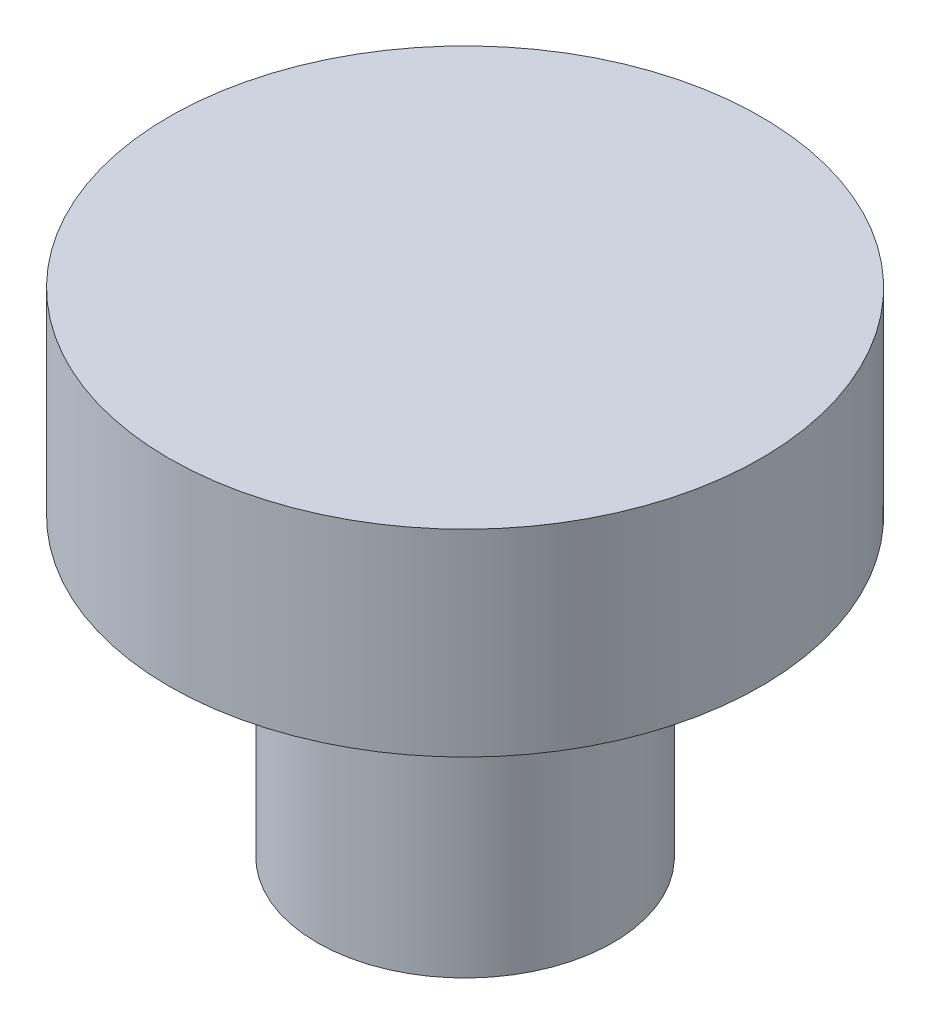
ISO-10303-21;
HEADER;
FILE_DESCRIPTION(('STEP AP214'),'2;1');
FILE_NAME('part.step','',(''),(''),'','','');
FILE_SCHEMA(('AUTOMOTIVE_DESIGN { 1 0 10303 214 1 1 1 1 }'));
ENDSEC;
DATA;
#1=APPLICATION_CONTEXT('core data for automotive mechanical design processes');
#2=APPLICATION_PROTOCOL_DEFINITION('international standard','automotive_design',2000,#1);
#3=PRODUCT_CONTEXT('',#1,'mechanical');
#4=PRODUCT('Part','Part','',(#3));
#5=PRODUCT_RELATED_PRODUCT_CATEGORY('part','',(#4));
#6=PRODUCT_DEFINITION_FORMATION('','',#4);
#7=PRODUCT_DEFINITION_CONTEXT('part definition',#1,'design');
#8=PRODUCT_DEFINITION('design','',#6,#7);
#9=PRODUCT_DEFINITION_SHAPE('','',#8);
#10=(LENGTH_UNIT() NAMED_UNIT(*) SI_UNIT(.MILLI.,.METRE.));
#11=(NAMED_UNIT(*) PLANE_ANGLE_UNIT() SI_UNIT($,.RADIAN.));
#12=(NAMED_UNIT(*) SI_UNIT($,.STERADIAN.) SOLID_ANGLE_UNIT());
#13=UNCERTAINTY_MEASURE_WITH_UNIT(LENGTH_MEASURE(1.E-05),#10,'distance_accuracy_value','');
#14=(GEOMETRIC_REPRESENTATION_CONTEXT(3) GLOBAL_UNCERTAINTY_ASSIGNED_CONTEXT((#13)) GLOBAL_UNIT_ASSIGNED_CONTEXT((#10,
#11,#12)) REPRESENTATION_CONTEXT('',''));
#15=CARTESIAN_POINT('',(0.,0.,0.));
#16=DIRECTION('',(0.,0.,1.));
#17=DIRECTION('',(1.,0.,0.));
#18=AXIS2_PLACEMENT_3D('',#15,#16,#17);
#19=CARTESIAN_POINT('',(0.,3.,0.));
#20=DIRECTION('',(0.,-1.,0.));
#21=DIRECTION('',(0.,0.,-1.));
#22=AXIS2_PLACEMENT_3D('',#19,#20,#21);
#23=CYLINDRICAL_SURFACE('',#22,1.5);
#24=CARTESIAN_POINT('',(0.,3.,0.));
#25=DIRECTION('',(0.,1.,0.));
#26=DIRECTION('',(0.,0.,1.));
#27=AXIS2_PLACEMENT_3D('',#24,#25,#26);
#28=CIRCLE('',#27,1.5);
#29=CARTESIAN_POINT('',(0.,3.,1.5));
#30=VERTEX_POINT('',#29);
#31=EDGE_CURVE('E10',#30,#30,#28,.T.);
#32=ORIENTED_EDGE('',*,*,#31,.F.);
#33=EDGE_LOOP('',(#32));
#34=FACE_BOUND('',#33,.T.);
#35=CARTESIAN_POINT('',(0.,0.,0.));
#36=DIRECTION('',(0.,1.,0.));
#37=DIRECTION('',(0.,0.,1.));
#38=AXIS2_PLACEMENT_3D('',#35,#36,#37);
#39=CIRCLE('',#38,1.5);
#40=CARTESIAN_POINT('',(0.,0.,1.5));
#41=VERTEX_POINT('',#40);
#42=EDGE_CURVE('E42',#41,#41,#39,.T.);
#43=ORIENTED_EDGE('',*,*,#42,.T.);
#44=EDGE_LOOP('',(#43));
#45=FACE_BOUND('',#44,.T.);
#46=ADVANCED_FACE('F39',(#34,#45),#23,.T.);
#47=CARTESIAN_POINT('',(0.,0.,0.));
#48=DIRECTION('',(0.,1.,0.));
#49=DIRECTION('',(0.,0.,1.));
#50=AXIS2_PLACEMENT_3D('',#47,#48,#49);
#51=PLANE('',#50);
#52=ORIENTED_EDGE('',*,*,#42,.F.);
#53=EDGE_LOOP('',(#52));
#54=FACE_BOUND('',#53,.T.);
#55=ADVANCED_FACE('F66',(#54),#51,.F.);
#56=CARTESIAN_POINT('',(0.,5.,0.));
#57=DIRECTION('',(0.,-1.,0.));
#58=DIRECTION('',(0.,0.,-1.));
#59=AXIS2_PLACEMENT_3D('',#56,#57,#58);
#60=CYLINDRICAL_SURFACE('',#59,3.);
#61=CARTESIAN_POINT('',(0.,5.,0.));
#62=DIRECTION('',(0.,1.,0.));
#63=DIRECTION('',(0.,0.,1.));
#64=AXIS2_PLACEMENT_3D('',#61,#62,#63);
#65=CIRCLE('',#64,3.);
#66=CARTESIAN_POINT('',(0.,5.,3.));
#67=VERTEX_POINT('',#66);
#68=EDGE_CURVE('E51',#67,#67,#65,.T.);
#69=ORIENTED_EDGE('',*,*,#68,.F.);
#70=EDGE_LOOP('',(#69));
#71=FACE_BOUND('',#70,.T.);
#72=CARTESIAN_POINT('',(0.,3.,0.));
#73=DIRECTION('',(0.,1.,0.));
#74=DIRECTION('',(0.,0.,1.));
#75=AXIS2_PLACEMENT_3D('',#72,#73,#74);
#76=CIRCLE('',#75,3.);
#77=CARTESIAN_POINT('',(0.,3.,3.));
#78=VERTEX_POINT('',#77);
#79=EDGE_CURVE('E53',#78,#78,#76,.T.);
#80=ORIENTED_EDGE('',*,*,#79,.T.);
#81=EDGE_LOOP('',(#80));
#82=FACE_BOUND('',#81,.T.);
#83=ADVANCED_FACE('F63',(#71,#82),#60,.T.);
#84=CARTESIAN_POINT('',(0.,5.,0.));
#85=DIRECTION('',(0.,1.,0.));
#86=DIRECTION('',(0.,0.,1.));
#87=AXIS2_PLACEMENT_3D('',#84,#85,#86);
#88=PLANE('',#87);
#89=ORIENTED_EDGE('',*,*,#68,.T.);
#90=EDGE_LOOP('',(#89));
#91=FACE_BOUND('',#90,.T.);
#92=ADVANCED_FACE('F61',(#91),#88,.T.);
#93=CARTESIAN_POINT('',(0.,3.,0.));
#94=DIRECTION('',(0.,1.,0.));
#95=DIRECTION('',(0.,0.,1.));
#96=AXIS2_PLACEMENT_3D('',#93,#94,#95);
#97=PLANE('',#96);
#98=ORIENTED_EDGE('',*,*,#31,.T.);
#99=EDGE_LOOP('',(#98));
#100=FACE_BOUND('',#99,.T.);
#101=ORIENTED_EDGE('',*,*,#79,.F.);
#102=EDGE_LOOP('',(#101));
#103=FACE_BOUND('',#102,.T.);
#104=ADVANCED_FACE('F70',(#100,#103),#97,.F.);
#105=CLOSED_SHELL('',(#46,#55,#83,#92,#104));
#106=MANIFOLD_SOLID_BREP('B2',#105);
#107=ADVANCED_BREP_SHAPE_REPRESENTATION('',(#18,#106),#14);
#108=SHAPE_DEFINITION_REPRESENTATION(#9,#107);
ENDSEC;
END-ISO-10303-21;
